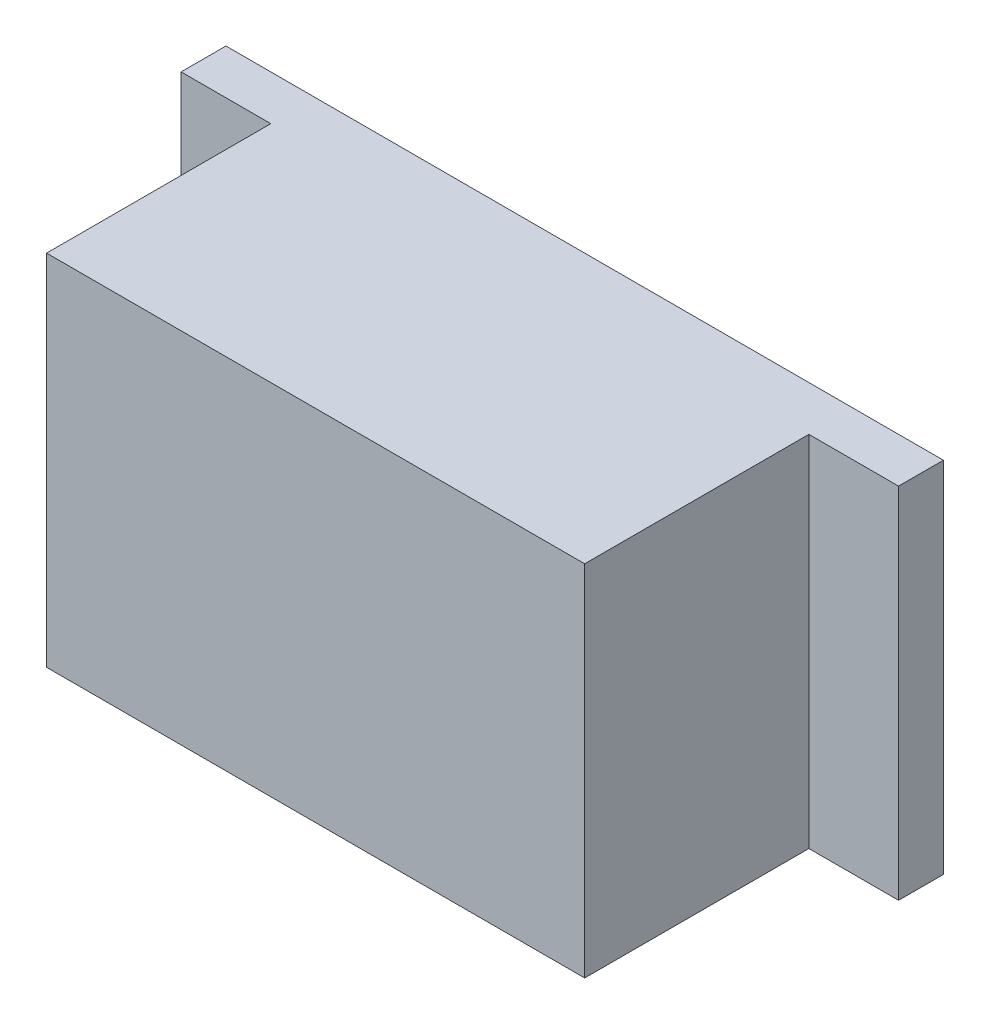
ISO-10303-21;
HEADER;
FILE_DESCRIPTION(('STEP AP214'),'2;1');
FILE_NAME('part.step','',(''),(''),'','','');
FILE_SCHEMA(('AUTOMOTIVE_DESIGN { 1 0 10303 214 1 1 1 1 }'));
ENDSEC;
DATA;
#1=APPLICATION_CONTEXT('core data for automotive mechanical design processes');
#2=APPLICATION_PROTOCOL_DEFINITION('international standard','automotive_design',2000,#1);
#3=PRODUCT_CONTEXT('',#1,'mechanical');
#4=PRODUCT('Part','Part','',(#3));
#5=PRODUCT_RELATED_PRODUCT_CATEGORY('part','',(#4));
#6=PRODUCT_DEFINITION_FORMATION('','',#4);
#7=PRODUCT_DEFINITION_CONTEXT('part definition',#1,'design');
#8=PRODUCT_DEFINITION('design','',#6,#7);
#9=PRODUCT_DEFINITION_SHAPE('','',#8);
#10=(LENGTH_UNIT() NAMED_UNIT(*) SI_UNIT(.MILLI.,.METRE.));
#11=(NAMED_UNIT(*) PLANE_ANGLE_UNIT() SI_UNIT($,.RADIAN.));
#12=(NAMED_UNIT(*) SI_UNIT($,.STERADIAN.) SOLID_ANGLE_UNIT());
#13=UNCERTAINTY_MEASURE_WITH_UNIT(LENGTH_MEASURE(1.E-05),#10,'distance_accuracy_value','');
#14=(GEOMETRIC_REPRESENTATION_CONTEXT(3) GLOBAL_UNCERTAINTY_ASSIGNED_CONTEXT((#13)) GLOBAL_UNIT_ASSIGNED_CONTEXT((#10,
#11,#12)) REPRESENTATION_CONTEXT('',''));
#15=CARTESIAN_POINT('',(0.,0.,0.));
#16=DIRECTION('',(0.,0.,1.));
#17=DIRECTION('',(1.,0.,0.));
#18=AXIS2_PLACEMENT_3D('',#15,#16,#17);
#19=CARTESIAN_POINT('',(-0.6,-0.4,0.1));
#20=DIRECTION('',(1.,0.,0.));
#21=DIRECTION('',(0.,0.,-1.));
#22=AXIS2_PLACEMENT_3D('',#19,#20,#21);
#23=PLANE('',#22);
#24=DIRECTION('',(0.,0.,-1.));
#25=VECTOR('',#24,1.);
#26=CARTESIAN_POINT('',(-0.6,-0.4,0.));
#27=LINE('',#26,#25);
#28=CARTESIAN_POINT('',(-0.6,-0.4,0.6));
#29=VERTEX_POINT('',#28);
#30=CARTESIAN_POINT('',(-0.6,-0.4,0.1));
#31=VERTEX_POINT('',#30);
#32=EDGE_CURVE('E132',#29,#31,#27,.T.);
#33=ORIENTED_EDGE('',*,*,#32,.F.);
#34=DIRECTION('',(0.,1.,0.));
#35=VECTOR('',#34,1.);
#36=CARTESIAN_POINT('',(-0.6,0.,0.6));
#37=LINE('',#36,#35);
#38=CARTESIAN_POINT('',(-0.6,0.4,0.6));
#39=VERTEX_POINT('',#38);
#40=EDGE_CURVE('E101',#39,#29,#37,.F.);
#41=ORIENTED_EDGE('',*,*,#40,.F.);
#42=DIRECTION('',(0.,0.,1.));
#43=VECTOR('',#42,1.);
#44=CARTESIAN_POINT('',(-0.6,0.4,0.));
#45=LINE('',#44,#43);
#46=CARTESIAN_POINT('',(-0.6,0.4,0.1));
#47=VERTEX_POINT('',#46);
#48=EDGE_CURVE('E109',#47,#39,#45,.T.);
#49=ORIENTED_EDGE('',*,*,#48,.F.);
#50=DIRECTION('',(0.,1.,0.));
#51=VECTOR('',#50,1.);
#52=CARTESIAN_POINT('',(-0.6,0.,0.1));
#53=LINE('',#52,#51);
#54=EDGE_CURVE('E20',#31,#47,#53,.T.);
#55=ORIENTED_EDGE('',*,*,#54,.F.);
#56=EDGE_LOOP('',(#33,#41,#49,#55));
#57=FACE_BOUND('',#56,.T.);
#58=ADVANCED_FACE('F17',(#57),#23,.F.);
#59=CARTESIAN_POINT('',(0.,0.,0.1));
#60=DIRECTION('',(0.,0.,1.));
#61=DIRECTION('',(1.,0.,0.));
#62=AXIS2_PLACEMENT_3D('',#59,#60,#61);
#63=PLANE('',#62);
#64=DIRECTION('',(1.,0.,0.));
#65=VECTOR('',#64,1.);
#66=CARTESIAN_POINT('',(-0.8,-0.4,0.1));
#67=LINE('',#66,#65);
#68=CARTESIAN_POINT('',(-0.8,-0.4,0.1));
#69=VERTEX_POINT('',#68);
#70=EDGE_CURVE('E120',#31,#69,#67,.F.);
#71=ORIENTED_EDGE('',*,*,#70,.F.);
#72=ORIENTED_EDGE('',*,*,#54,.T.);
#73=DIRECTION('',(1.,0.,0.));
#74=VECTOR('',#73,1.);
#75=CARTESIAN_POINT('',(0.8,0.4,0.1));
#76=LINE('',#75,#74);
#77=CARTESIAN_POINT('',(-0.8,0.4,0.1));
#78=VERTEX_POINT('',#77);
#79=EDGE_CURVE('E106',#78,#47,#76,.T.);
#80=ORIENTED_EDGE('',*,*,#79,.F.);
#81=DIRECTION('',(0.,1.,0.));
#82=VECTOR('',#81,1.);
#83=CARTESIAN_POINT('',(-0.8,0.4,0.1));
#84=LINE('',#83,#82);
#85=EDGE_CURVE('E127',#69,#78,#84,.T.);
#86=ORIENTED_EDGE('',*,*,#85,.F.);
#87=EDGE_LOOP('',(#71,#72,#80,#86));
#88=FACE_BOUND('',#87,.T.);
#89=ADVANCED_FACE('F117',(#88),#63,.T.);
#90=CARTESIAN_POINT('',(0.6,0.4,0.1));
#91=DIRECTION('',(-1.,0.,0.));
#92=DIRECTION('',(0.,0.,1.));
#93=AXIS2_PLACEMENT_3D('',#90,#91,#92);
#94=PLANE('',#93);
#95=DIRECTION('',(0.,0.,1.));
#96=VECTOR('',#95,1.);
#97=CARTESIAN_POINT('',(0.6,0.4,0.));
#98=LINE('',#97,#96);
#99=CARTESIAN_POINT('',(0.6,0.4,0.6));
#100=VERTEX_POINT('',#99);
#101=CARTESIAN_POINT('',(0.6,0.4,0.1));
#102=VERTEX_POINT('',#101);
#103=EDGE_CURVE('E84',#100,#102,#98,.F.);
#104=ORIENTED_EDGE('',*,*,#103,.F.);
#105=DIRECTION('',(0.,1.,0.));
#106=VECTOR('',#105,1.);
#107=CARTESIAN_POINT('',(0.6,0.,0.6));
#108=LINE('',#107,#106);
#109=CARTESIAN_POINT('',(0.6,-0.4,0.6));
#110=VERTEX_POINT('',#109);
#111=EDGE_CURVE('E79',#110,#100,#108,.T.);
#112=ORIENTED_EDGE('',*,*,#111,.F.);
#113=DIRECTION('',(0.,0.,-1.));
#114=VECTOR('',#113,1.);
#115=CARTESIAN_POINT('',(0.6,-0.4,0.));
#116=LINE('',#115,#114);
#117=CARTESIAN_POINT('',(0.6,-0.4,0.1));
#118=VERTEX_POINT('',#117);
#119=EDGE_CURVE('E97',#118,#110,#116,.F.);
#120=ORIENTED_EDGE('',*,*,#119,.F.);
#121=DIRECTION('',(0.,1.,0.));
#122=VECTOR('',#121,1.);
#123=CARTESIAN_POINT('',(0.6,0.,0.1));
#124=LINE('',#123,#122);
#125=EDGE_CURVE('E93',#102,#118,#124,.F.);
#126=ORIENTED_EDGE('',*,*,#125,.F.);
#127=EDGE_LOOP('',(#104,#112,#120,#126));
#128=FACE_BOUND('',#127,.T.);
#129=ADVANCED_FACE('F96',(#128),#94,.F.);
#130=CARTESIAN_POINT('',(0.,0.,0.6));
#131=DIRECTION('',(0.,0.,1.));
#132=DIRECTION('',(1.,0.,0.));
#133=AXIS2_PLACEMENT_3D('',#130,#131,#132);
#134=PLANE('',#133);
#135=DIRECTION('',(1.,0.,0.));
#136=VECTOR('',#135,1.);
#137=CARTESIAN_POINT('',(0.8,0.4,0.6));
#138=LINE('',#137,#136);
#139=EDGE_CURVE('E91',#39,#100,#138,.T.);
#140=ORIENTED_EDGE('',*,*,#139,.F.);
#141=ORIENTED_EDGE('',*,*,#40,.T.);
#142=DIRECTION('',(1.,0.,0.));
#143=VECTOR('',#142,1.);
#144=CARTESIAN_POINT('',(-0.8,-0.4,0.6));
#145=LINE('',#144,#143);
#146=EDGE_CURVE('E140',#110,#29,#145,.F.);
#147=ORIENTED_EDGE('',*,*,#146,.F.);
#148=ORIENTED_EDGE('',*,*,#111,.T.);
#149=EDGE_LOOP('',(#140,#141,#147,#148));
#150=FACE_BOUND('',#149,.T.);
#151=ADVANCED_FACE('F208',(#150),#134,.T.);
#152=CARTESIAN_POINT('',(0.,0.,0.1));
#153=DIRECTION('',(0.,0.,1.));
#154=DIRECTION('',(1.,0.,0.));
#155=AXIS2_PLACEMENT_3D('',#152,#153,#154);
#156=PLANE('',#155);
#157=DIRECTION('',(0.,1.,0.));
#158=VECTOR('',#157,1.);
#159=CARTESIAN_POINT('',(0.8,-0.4,0.1));
#160=LINE('',#159,#158);
#161=CARTESIAN_POINT('',(0.8,0.4,0.1));
#162=VERTEX_POINT('',#161);
#163=CARTESIAN_POINT('',(0.8,-0.4,0.1));
#164=VERTEX_POINT('',#163);
#165=EDGE_CURVE('E105',#162,#164,#160,.F.);
#166=ORIENTED_EDGE('',*,*,#165,.F.);
#167=DIRECTION('',(1.,0.,0.));
#168=VECTOR('',#167,1.);
#169=CARTESIAN_POINT('',(0.8,0.4,0.1));
#170=LINE('',#169,#168);
#171=EDGE_CURVE('E89',#102,#162,#170,.T.);
#172=ORIENTED_EDGE('',*,*,#171,.F.);
#173=ORIENTED_EDGE('',*,*,#125,.T.);
#174=DIRECTION('',(1.,0.,0.));
#175=VECTOR('',#174,1.);
#176=CARTESIAN_POINT('',(-0.8,-0.4,0.1));
#177=LINE('',#176,#175);
#178=EDGE_CURVE('E137',#164,#118,#177,.F.);
#179=ORIENTED_EDGE('',*,*,#178,.F.);
#180=EDGE_LOOP('',(#166,#172,#173,#179));
#181=FACE_BOUND('',#180,.T.);
#182=ADVANCED_FACE('F104',(#181),#156,.T.);
#183=CARTESIAN_POINT('',(0.8,0.4,0.));
#184=DIRECTION('',(0.,1.,0.));
#185=DIRECTION('',(0.,0.,1.));
#186=AXIS2_PLACEMENT_3D('',#183,#184,#185);
#187=PLANE('',#186);
#188=ORIENTED_EDGE('',*,*,#48,.T.);
#189=ORIENTED_EDGE('',*,*,#139,.T.);
#190=ORIENTED_EDGE('',*,*,#103,.T.);
#191=ORIENTED_EDGE('',*,*,#171,.T.);
#192=DIRECTION('',(0.,0.,-1.));
#193=VECTOR('',#192,1.);
#194=CARTESIAN_POINT('',(0.8,0.4,0.));
#195=LINE('',#194,#193);
#196=CARTESIAN_POINT('',(0.8,0.4,0.));
#197=VERTEX_POINT('',#196);
#198=EDGE_CURVE('E143',#197,#162,#195,.F.);
#199=ORIENTED_EDGE('',*,*,#198,.F.);
#200=DIRECTION('',(1.,0.,0.));
#201=VECTOR('',#200,1.);
#202=CARTESIAN_POINT('',(0.,0.4,0.));
#203=LINE('',#202,#201);
#204=CARTESIAN_POINT('',(-0.8,0.4,0.));
#205=VERTEX_POINT('',#204);
#206=EDGE_CURVE('E147',#197,#205,#203,.F.);
#207=ORIENTED_EDGE('',*,*,#206,.T.);
#208=DIRECTION('',(0.,0.,1.));
#209=VECTOR('',#208,1.);
#210=CARTESIAN_POINT('',(-0.8,0.4,0.));
#211=LINE('',#210,#209);
#212=EDGE_CURVE('E126',#78,#205,#211,.F.);
#213=ORIENTED_EDGE('',*,*,#212,.F.);
#214=ORIENTED_EDGE('',*,*,#79,.T.);
#215=EDGE_LOOP('',(#188,#189,#190,#191,#199,#207,#213,#214));
#216=FACE_BOUND('',#215,.T.);
#217=ADVANCED_FACE('F86',(#216),#187,.T.);
#218=CARTESIAN_POINT('',(-0.8,0.4,0.));
#219=DIRECTION('',(-1.,0.,0.));
#220=DIRECTION('',(0.,0.,1.));
#221=AXIS2_PLACEMENT_3D('',#218,#219,#220);
#222=PLANE('',#221);
#223=ORIENTED_EDGE('',*,*,#212,.T.);
#224=DIRECTION('',(0.,1.,0.));
#225=VECTOR('',#224,1.);
#226=CARTESIAN_POINT('',(-0.8,0.,0.));
#227=LINE('',#226,#225);
#228=CARTESIAN_POINT('',(-0.8,-0.4,0.));
#229=VERTEX_POINT('',#228);
#230=EDGE_CURVE('E149',#205,#229,#227,.F.);
#231=ORIENTED_EDGE('',*,*,#230,.T.);
#232=DIRECTION('',(0.,0.,-1.));
#233=VECTOR('',#232,1.);
#234=CARTESIAN_POINT('',(-0.8,-0.4,0.));
#235=LINE('',#234,#233);
#236=EDGE_CURVE('E135',#69,#229,#235,.T.);
#237=ORIENTED_EDGE('',*,*,#236,.F.);
#238=ORIENTED_EDGE('',*,*,#85,.T.);
#239=EDGE_LOOP('',(#223,#231,#237,#238));
#240=FACE_BOUND('',#239,.T.);
#241=ADVANCED_FACE('F161',(#240),#222,.T.);
#242=CARTESIAN_POINT('',(-0.8,-0.4,0.));
#243=DIRECTION('',(0.,-1.,0.));
#244=DIRECTION('',(0.,0.,-1.));
#245=AXIS2_PLACEMENT_3D('',#242,#243,#244);
#246=PLANE('',#245);
#247=ORIENTED_EDGE('',*,*,#119,.T.);
#248=ORIENTED_EDGE('',*,*,#146,.T.);
#249=ORIENTED_EDGE('',*,*,#32,.T.);
#250=ORIENTED_EDGE('',*,*,#70,.T.);
#251=ORIENTED_EDGE('',*,*,#236,.T.);
#252=DIRECTION('',(1.,0.,0.));
#253=VECTOR('',#252,1.);
#254=CARTESIAN_POINT('',(0.,-0.4,0.));
#255=LINE('',#254,#253);
#256=CARTESIAN_POINT('',(0.8,-0.4,0.));
#257=VERTEX_POINT('',#256);
#258=EDGE_CURVE('E26',#229,#257,#255,.T.);
#259=ORIENTED_EDGE('',*,*,#258,.T.);
#260=DIRECTION('',(0.,0.,-1.));
#261=VECTOR('',#260,1.);
#262=CARTESIAN_POINT('',(0.8,-0.4,0.));
#263=LINE('',#262,#261);
#264=EDGE_CURVE('E34',#164,#257,#263,.T.);
#265=ORIENTED_EDGE('',*,*,#264,.F.);
#266=ORIENTED_EDGE('',*,*,#178,.T.);
#267=EDGE_LOOP('',(#247,#248,#249,#250,#251,#259,#265,#266));
#268=FACE_BOUND('',#267,.T.);
#269=ADVANCED_FACE('F155',(#268),#246,.T.);
#270=CARTESIAN_POINT('',(0.8,-0.4,0.));
#271=DIRECTION('',(1.,0.,0.));
#272=DIRECTION('',(0.,0.,-1.));
#273=AXIS2_PLACEMENT_3D('',#270,#271,#272);
#274=PLANE('',#273);
#275=ORIENTED_EDGE('',*,*,#264,.T.);
#276=DIRECTION('',(0.,1.,0.));
#277=VECTOR('',#276,1.);
#278=CARTESIAN_POINT('',(0.8,0.,0.));
#279=LINE('',#278,#277);
#280=EDGE_CURVE('E11',#257,#197,#279,.T.);
#281=ORIENTED_EDGE('',*,*,#280,.T.);
#282=ORIENTED_EDGE('',*,*,#198,.T.);
#283=ORIENTED_EDGE('',*,*,#165,.T.);
#284=EDGE_LOOP('',(#275,#281,#282,#283));
#285=FACE_BOUND('',#284,.T.);
#286=ADVANCED_FACE('F169',(#285),#274,.T.);
#287=CARTESIAN_POINT('',(0.,0.,0.));
#288=DIRECTION('',(0.,0.,1.));
#289=DIRECTION('',(1.,0.,0.));
#290=AXIS2_PLACEMENT_3D('',#287,#288,#289);
#291=PLANE('',#290);
#292=ORIENTED_EDGE('',*,*,#258,.F.);
#293=ORIENTED_EDGE('',*,*,#230,.F.);
#294=ORIENTED_EDGE('',*,*,#206,.F.);
#295=ORIENTED_EDGE('',*,*,#280,.F.);
#296=EDGE_LOOP('',(#292,#293,#294,#295));
#297=FACE_BOUND('',#296,.T.);
#298=ADVANCED_FACE('F159',(#297),#291,.F.);
#299=CLOSED_SHELL('',(#58,#89,#129,#151,#182,#217,#241,#269,#286,#298));
#300=MANIFOLD_SOLID_BREP('B1',#299);
#301=ADVANCED_BREP_SHAPE_REPRESENTATION('',(#18,#300),#14);
#302=SHAPE_DEFINITION_REPRESENTATION(#9,#301);
ENDSEC;
END-ISO-10303-21;
